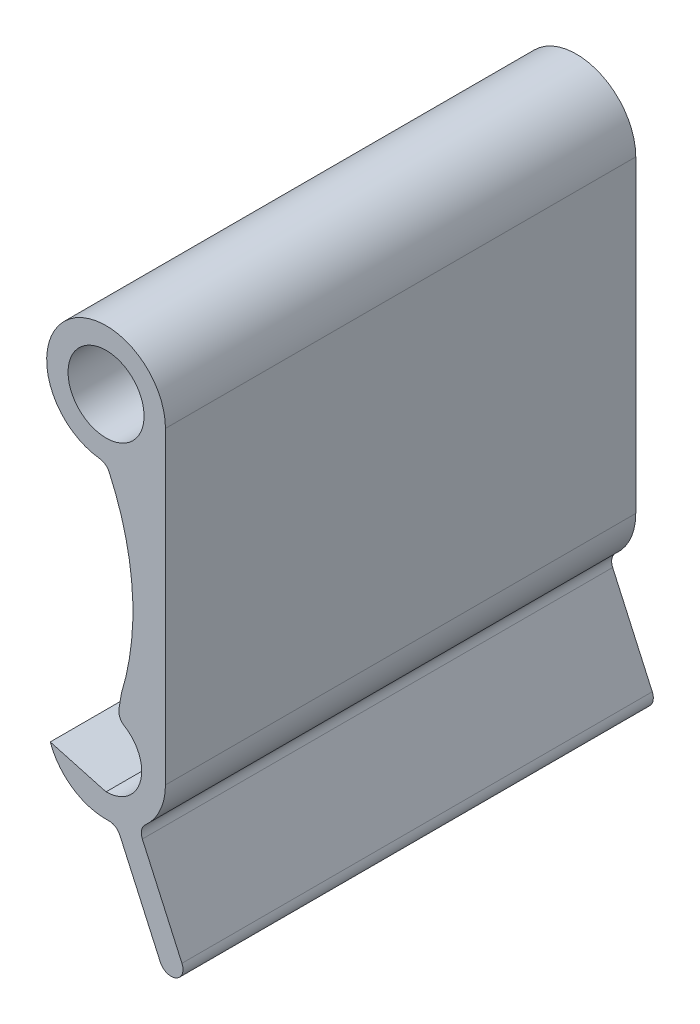
ISO-10303-21;
HEADER;
FILE_DESCRIPTION(('STEP AP214'),'2;1');
FILE_NAME('part.step','',(''),(''),'','','');
FILE_SCHEMA(('AUTOMOTIVE_DESIGN { 1 0 10303 214 1 1 1 1 }'));
ENDSEC;
DATA;
#1=APPLICATION_CONTEXT('core data for automotive mechanical design processes');
#2=APPLICATION_PROTOCOL_DEFINITION('international standard','automotive_design',2000,#1);
#3=PRODUCT_CONTEXT('',#1,'mechanical');
#4=PRODUCT('Part','Part','',(#3));
#5=PRODUCT_RELATED_PRODUCT_CATEGORY('part','',(#4));
#6=PRODUCT_DEFINITION_FORMATION('','',#4);
#7=PRODUCT_DEFINITION_CONTEXT('part definition',#1,'design');
#8=PRODUCT_DEFINITION('design','',#6,#7);
#9=PRODUCT_DEFINITION_SHAPE('','',#8);
#10=(LENGTH_UNIT() NAMED_UNIT(*) SI_UNIT(.MILLI.,.METRE.));
#11=(NAMED_UNIT(*) PLANE_ANGLE_UNIT() SI_UNIT($,.RADIAN.));
#12=(NAMED_UNIT(*) SI_UNIT($,.STERADIAN.) SOLID_ANGLE_UNIT());
#13=UNCERTAINTY_MEASURE_WITH_UNIT(LENGTH_MEASURE(1.E-05),#10,'distance_accuracy_value','');
#14=(GEOMETRIC_REPRESENTATION_CONTEXT(3) GLOBAL_UNCERTAINTY_ASSIGNED_CONTEXT((#13)) GLOBAL_UNIT_ASSIGNED_CONTEXT((#10,
#11,#12)) REPRESENTATION_CONTEXT('',''));
#15=CARTESIAN_POINT('',(0.,0.,0.));
#16=DIRECTION('',(0.,0.,1.));
#17=DIRECTION('',(1.,0.,0.));
#18=AXIS2_PLACEMENT_3D('',#15,#16,#17);
#19=CARTESIAN_POINT('',(0.,-13.,19.8));
#20=DIRECTION('',(0.,0.,-1.));
#21=DIRECTION('',(-1.,0.,0.));
#22=AXIS2_PLACEMENT_3D('',#19,#20,#21);
#23=CYLINDRICAL_SURFACE('',#22,2.5);
#24=CARTESIAN_POINT('',(0.,-13.,19.8));
#25=DIRECTION('',(0.,0.,1.));
#26=DIRECTION('',(1.,0.,0.));
#27=AXIS2_PLACEMENT_3D('',#24,#25,#26);
#28=CIRCLE('',#27,2.5);
#29=CARTESIAN_POINT('',(1.65310921890805,-14.8754279272639,19.8));
#30=VERTEX_POINT('',#29);
#31=CARTESIAN_POINT('',(2.5,-13.0000000000005,19.8));
#32=VERTEX_POINT('',#31);
#33=EDGE_CURVE('E206',#30,#32,#28,.T.);
#34=ORIENTED_EDGE('',*,*,#33,.F.);
#35=DIRECTION('',(0.,0.,-1.));
#36=VECTOR('',#35,1.);
#37=CARTESIAN_POINT('',(1.65310921890805,-14.8754279272639,19.8));
#38=LINE('',#37,#36);
#39=CARTESIAN_POINT('',(1.65310921890805,-14.8754279272639,0.));
#40=VERTEX_POINT('',#39);
#41=EDGE_CURVE('E308',#30,#40,#38,.T.);
#42=ORIENTED_EDGE('',*,*,#41,.T.);
#43=CARTESIAN_POINT('',(0.,-13.,0.));
#44=DIRECTION('',(0.,0.,1.));
#45=DIRECTION('',(1.,0.,0.));
#46=AXIS2_PLACEMENT_3D('',#43,#44,#45);
#47=CIRCLE('',#46,2.5);
#48=CARTESIAN_POINT('',(2.5,-13.0000000000005,0.));
#49=VERTEX_POINT('',#48);
#50=EDGE_CURVE('E237',#40,#49,#47,.T.);
#51=ORIENTED_EDGE('',*,*,#50,.T.);
#52=DIRECTION('',(0.,0.,-1.));
#53=VECTOR('',#52,1.);
#54=CARTESIAN_POINT('',(2.5,-13.0000000000005,19.8));
#55=LINE('',#54,#53);
#56=EDGE_CURVE('E247',#32,#49,#55,.T.);
#57=ORIENTED_EDGE('',*,*,#56,.F.);
#58=EDGE_LOOP('',(#34,#42,#51,#57));
#59=FACE_BOUND('',#58,.T.);
#60=ADVANCED_FACE('F47',(#59),#23,.T.);
#61=CARTESIAN_POINT('',(-2.34950306999728,-13.8543039997995,0.));
#62=VERTEX_POINT('',#61);
#63=CARTESIAN_POINT('',(0.105471364558041,-15.4977741673855,0.));
#64=VERTEX_POINT('',#63);
#65=EDGE_CURVE('E238',#62,#64,#47,.T.);
#66=ORIENTED_EDGE('',*,*,#65,.T.);
#67=DIRECTION('',(0.,0.,-1.));
#68=VECTOR('',#67,1.);
#69=CARTESIAN_POINT('',(0.10547136455804,-15.4977741673855,19.8));
#70=LINE('',#69,#68);
#71=CARTESIAN_POINT('',(0.105471364558041,-15.4977741673855,19.8));
#72=VERTEX_POINT('',#71);
#73=EDGE_CURVE('E304',#64,#72,#70,.F.);
#74=ORIENTED_EDGE('',*,*,#73,.T.);
#75=CARTESIAN_POINT('',(-2.34950306999728,-13.8543039997995,19.8));
#76=VERTEX_POINT('',#75);
#77=EDGE_CURVE('E207',#76,#72,#28,.T.);
#78=ORIENTED_EDGE('',*,*,#77,.F.);
#79=DIRECTION('',(0.,0.,-1.));
#80=VECTOR('',#79,1.);
#81=CARTESIAN_POINT('',(-2.34950306999728,-13.8543039997995,19.8));
#82=LINE('',#81,#80);
#83=EDGE_CURVE('E251',#76,#62,#82,.T.);
#84=ORIENTED_EDGE('',*,*,#83,.T.);
#85=EDGE_LOOP('',(#66,#74,#78,#84));
#86=FACE_BOUND('',#85,.T.);
#87=ADVANCED_FACE('F369',(#86),#23,.T.);
#88=CARTESIAN_POINT('',(0.,0.,19.8));
#89=DIRECTION('',(0.,0.,-1.));
#90=DIRECTION('',(-1.,0.,0.));
#91=AXIS2_PLACEMENT_3D('',#88,#89,#90);
#92=CYLINDRICAL_SURFACE('',#91,2.5);
#93=CARTESIAN_POINT('',(0.,0.,0.));
#94=DIRECTION('',(0.,0.,1.));
#95=DIRECTION('',(1.,0.,0.));
#96=AXIS2_PLACEMENT_3D('',#93,#94,#95);
#97=CIRCLE('',#96,2.5);
#98=CARTESIAN_POINT('',(2.5,2.44365617151077E-13,0.));
#99=VERTEX_POINT('',#98);
#100=CARTESIAN_POINT('',(-0.270271846246739,-2.48534768777457,0.));
#101=VERTEX_POINT('',#100);
#102=EDGE_CURVE('E220',#99,#101,#97,.T.);
#103=ORIENTED_EDGE('',*,*,#102,.T.);
#104=DIRECTION('',(0.,0.,-1.));
#105=VECTOR('',#104,1.);
#106=CARTESIAN_POINT('',(-0.270271846246739,-2.48534768777457,19.8));
#107=LINE('',#106,#105);
#108=CARTESIAN_POINT('',(-0.270271846246739,-2.48534768777457,19.8));
#109=VERTEX_POINT('',#108);
#110=EDGE_CURVE('E259',#101,#109,#107,.F.);
#111=ORIENTED_EDGE('',*,*,#110,.T.);
#112=CARTESIAN_POINT('',(0.,0.,19.8));
#113=DIRECTION('',(0.,0.,1.));
#114=DIRECTION('',(1.,0.,0.));
#115=AXIS2_PLACEMENT_3D('',#112,#113,#114);
#116=CIRCLE('',#115,2.5);
#117=CARTESIAN_POINT('',(2.5,2.44365617151077E-13,19.8));
#118=VERTEX_POINT('',#117);
#119=EDGE_CURVE('E193',#118,#109,#116,.T.);
#120=ORIENTED_EDGE('',*,*,#119,.F.);
#121=DIRECTION('',(0.,0.,-1.));
#122=VECTOR('',#121,1.);
#123=CARTESIAN_POINT('',(2.5,2.44365617151077E-13,19.8));
#124=LINE('',#123,#122);
#125=EDGE_CURVE('E215',#118,#99,#124,.T.);
#126=ORIENTED_EDGE('',*,*,#125,.T.);
#127=EDGE_LOOP('',(#103,#111,#120,#126));
#128=FACE_BOUND('',#127,.T.);
#129=ADVANCED_FACE('F374',(#128),#92,.T.);
#130=CARTESIAN_POINT('',(-9.86981448001657,-7.35662044327691,19.8));
#131=DIRECTION('',(0.,0.,-1.));
#132=DIRECTION('',(-1.,0.,0.));
#133=AXIS2_PLACEMENT_3D('',#130,#131,#132);
#134=CYLINDRICAL_SURFACE('',#133,11.);
#135=CARTESIAN_POINT('',(-9.86981448001657,-7.35662044327691,19.8));
#136=DIRECTION('',(0.,0.,1.));
#137=DIRECTION('',(1.,0.,0.));
#138=AXIS2_PLACEMENT_3D('',#135,#136,#137);
#139=CIRCLE('',#138,11.);
#140=CARTESIAN_POINT('',(0.645816542223172,-10.5848559062054,19.8));
#141=VERTEX_POINT('',#140);
#142=CARTESIAN_POINT('',(0.130220844719175,-2.77412183399865,19.8));
#143=VERTEX_POINT('',#142);
#144=EDGE_CURVE('E175',#141,#143,#139,.T.);
#145=ORIENTED_EDGE('',*,*,#144,.T.);
#146=DIRECTION('',(0.,0.,-1.));
#147=VECTOR('',#146,1.);
#148=CARTESIAN_POINT('',(0.130220844719177,-2.77412183399865,19.8));
#149=LINE('',#148,#147);
#150=CARTESIAN_POINT('',(0.130220844719175,-2.77412183399865,0.));
#151=VERTEX_POINT('',#150);
#152=EDGE_CURVE('E185',#143,#151,#149,.T.);
#153=ORIENTED_EDGE('',*,*,#152,.T.);
#154=CARTESIAN_POINT('',(-9.86981448001657,-7.35662044327691,0.));
#155=DIRECTION('',(0.,0.,1.));
#156=DIRECTION('',(1.,0.,0.));
#157=AXIS2_PLACEMENT_3D('',#154,#155,#156);
#158=CIRCLE('',#157,11.);
#159=CARTESIAN_POINT('',(0.645816542223172,-10.5848559062054,0.));
#160=VERTEX_POINT('',#159);
#161=EDGE_CURVE('E183',#160,#151,#158,.T.);
#162=ORIENTED_EDGE('',*,*,#161,.F.);
#163=DIRECTION('',(0.,0.,-1.));
#164=VECTOR('',#163,1.);
#165=CARTESIAN_POINT('',(0.645816542223172,-10.5848559062054,19.8));
#166=LINE('',#165,#164);
#167=EDGE_CURVE('E166',#141,#160,#166,.T.);
#168=ORIENTED_EDGE('',*,*,#167,.F.);
#169=EDGE_LOOP('',(#145,#153,#162,#168));
#170=FACE_BOUND('',#169,.T.);
#171=ADVANCED_FACE('F179',(#170),#134,.F.);
#172=CARTESIAN_POINT('',(2.32846829789905,-0.384088888888882,19.8));
#173=DIRECTION('',(-0.986666666666667,0.162754074876448,0.));
#174=DIRECTION('',(-0.162754074876448,-0.986666666666667,0.));
#175=AXIS2_PLACEMENT_3D('',#172,#173,#174);
#176=PLANE('',#175);
#177=DIRECTION('',(0.162754074876448,0.986666666666667,0.));
#178=VECTOR('',#177,1.);
#179=CARTESIAN_POINT('',(2.32846829789905,-0.384088888888882,0.));
#180=LINE('',#179,#178);
#181=CARTESIAN_POINT('',(0.543014796365575,-11.2080725967235,0.));
#182=VERTEX_POINT('',#181);
#183=EDGE_CURVE('E227',#182,#160,#180,.T.);
#184=ORIENTED_EDGE('',*,*,#183,.F.);
#185=DIRECTION('',(0.,0.,-1.));
#186=VECTOR('',#185,1.);
#187=CARTESIAN_POINT('',(0.543014796365576,-11.2080725967235,19.8));
#188=LINE('',#187,#186);
#189=CARTESIAN_POINT('',(0.543014796365575,-11.2080725967235,19.8));
#190=VERTEX_POINT('',#189);
#191=EDGE_CURVE('E169',#182,#190,#188,.F.);
#192=ORIENTED_EDGE('',*,*,#191,.T.);
#193=DIRECTION('',(0.162754074876448,0.986666666666667,0.));
#194=VECTOR('',#193,1.);
#195=CARTESIAN_POINT('',(2.32846829789905,-0.384088888888882,19.8));
#196=LINE('',#195,#194);
#197=EDGE_CURVE('E162',#190,#141,#196,.T.);
#198=ORIENTED_EDGE('',*,*,#197,.T.);
#199=ORIENTED_EDGE('',*,*,#167,.T.);
#200=EDGE_LOOP('',(#184,#192,#198,#199));
#201=FACE_BOUND('',#200,.T.);
#202=ADVANCED_FACE('F165',(#201),#176,.T.);
#203=CARTESIAN_POINT('',(0.,-13.,19.8));
#204=DIRECTION('',(0.,0.,-1.));
#205=DIRECTION('',(-1.,0.,0.));
#206=AXIS2_PLACEMENT_3D('',#203,#204,#205);
#207=CYLINDRICAL_SURFACE('',#206,1.5);
#208=CARTESIAN_POINT('',(0.,-13.,19.8));
#209=DIRECTION('',(0.,0.,1.));
#210=DIRECTION('',(1.,0.,0.));
#211=AXIS2_PLACEMENT_3D('',#208,#209,#210);
#212=CIRCLE('',#211,1.5);
#213=CARTESIAN_POINT('',(0.,-14.5,19.8));
#214=VERTEX_POINT('',#213);
#215=CARTESIAN_POINT('',(0.777261097274181,-11.7170872256213,19.8));
#216=VERTEX_POINT('',#215);
#217=EDGE_CURVE('E174',#214,#216,#212,.T.);
#218=ORIENTED_EDGE('',*,*,#217,.T.);
#219=DIRECTION('',(0.,0.,-1.));
#220=VECTOR('',#219,1.);
#221=CARTESIAN_POINT('',(0.777261097274181,-11.7170872256213,19.8));
#222=LINE('',#221,#220);
#223=CARTESIAN_POINT('',(0.777261097274181,-11.7170872256213,0.));
#224=VERTEX_POINT('',#223);
#225=EDGE_CURVE('E262',#216,#224,#222,.T.);
#226=ORIENTED_EDGE('',*,*,#225,.T.);
#227=CARTESIAN_POINT('',(0.,-13.,0.));
#228=DIRECTION('',(0.,0.,1.));
#229=DIRECTION('',(1.,0.,0.));
#230=AXIS2_PLACEMENT_3D('',#227,#228,#229);
#231=CIRCLE('',#230,1.5);
#232=CARTESIAN_POINT('',(0.,-14.5,0.));
#233=VERTEX_POINT('',#232);
#234=EDGE_CURVE('E230',#233,#224,#231,.T.);
#235=ORIENTED_EDGE('',*,*,#234,.F.);
#236=DIRECTION('',(0.,0.,-1.));
#237=VECTOR('',#236,1.);
#238=CARTESIAN_POINT('',(0.,-14.5,19.8));
#239=LINE('',#238,#237);
#240=EDGE_CURVE('E186',#214,#233,#239,.T.);
#241=ORIENTED_EDGE('',*,*,#240,.F.);
#242=EDGE_LOOP('',(#218,#226,#235,#241));
#243=FACE_BOUND('',#242,.T.);
#244=ADVANCED_FACE('F380',(#243),#207,.F.);
#245=CARTESIAN_POINT('',(-3.70508886709022,-13.4817586993532,19.8));
#246=DIRECTION('',(-0.264997241449119,-0.964249170092646,0.));
#247=DIRECTION('',(0.964249170092646,-0.264997241449119,0.));
#248=AXIS2_PLACEMENT_3D('',#245,#246,#247);
#249=PLANE('',#248);
#250=DIRECTION('',(-0.964249170092646,0.264997241449119,0.));
#251=VECTOR('',#250,1.);
#252=CARTESIAN_POINT('',(-3.70508886709022,-13.4817586993532,0.));
#253=LINE('',#252,#251);
#254=EDGE_CURVE('E234',#233,#62,#253,.T.);
#255=ORIENTED_EDGE('',*,*,#254,.T.);
#256=ORIENTED_EDGE('',*,*,#83,.F.);
#257=DIRECTION('',(-0.964249170092646,0.264997241449119,0.));
#258=VECTOR('',#257,1.);
#259=CARTESIAN_POINT('',(-3.70508886709022,-13.4817586993532,19.8));
#260=LINE('',#259,#258);
#261=EDGE_CURVE('E203',#214,#76,#260,.T.);
#262=ORIENTED_EDGE('',*,*,#261,.F.);
#263=ORIENTED_EDGE('',*,*,#240,.T.);
#264=EDGE_LOOP('',(#255,#256,#262,#263));
#265=FACE_BOUND('',#264,.T.);
#266=ADVANCED_FACE('F377',(#265),#249,.F.);
#267=CARTESIAN_POINT('',(0.,0.,19.8));
#268=DIRECTION('',(0.,0.,-1.));
#269=DIRECTION('',(-1.,0.,0.));
#270=AXIS2_PLACEMENT_3D('',#267,#268,#269);
#271=CYLINDRICAL_SURFACE('',#270,1.6);
#272=CARTESIAN_POINT('',(0.,0.,19.8));
#273=DIRECTION('',(0.,0.,1.));
#274=DIRECTION('',(1.,0.,0.));
#275=AXIS2_PLACEMENT_3D('',#272,#273,#274);
#276=CIRCLE('',#275,1.6);
#277=CARTESIAN_POINT('',(-1.6,0.,19.8));
#278=VERTEX_POINT('',#277);
#279=EDGE_CURVE('E196',#278,#278,#276,.T.);
#280=CARTESIAN_POINT('',(0.,0.,0.));
#281=DIRECTION('',(0.,0.,1.));
#282=DIRECTION('',(1.,0.,0.));
#283=AXIS2_PLACEMENT_3D('',#280,#281,#282);
#284=CIRCLE('',#283,1.6);
#285=CARTESIAN_POINT('',(-1.6,0.,0.));
#286=VERTEX_POINT('',#285);
#287=EDGE_CURVE('E216',#286,#286,#284,.T.);
#288=CARTESIAN_POINT('',(-1.6,0.,19.8));
#289=CARTESIAN_POINT('',(-1.6,0.,19.59375));
#290=CARTESIAN_POINT('',(-1.6,0.,19.3875));
#291=CARTESIAN_POINT('',(-1.6,0.,18.975));
#292=CARTESIAN_POINT('',(-1.6,0.,18.76875));
#293=CARTESIAN_POINT('',(-1.6,0.,18.35625));
#294=CARTESIAN_POINT('',(-1.6,0.,18.15));
#295=CARTESIAN_POINT('',(-1.6,0.,17.7375));
#296=CARTESIAN_POINT('',(-1.6,0.,17.53125));
#297=CARTESIAN_POINT('',(-1.6,0.,17.11875));
#298=CARTESIAN_POINT('',(-1.6,0.,16.9125));
#299=CARTESIAN_POINT('',(-1.6,0.,16.5));
#300=CARTESIAN_POINT('',(-1.6,0.,16.29375));
#301=CARTESIAN_POINT('',(-1.6,0.,15.88125));
#302=CARTESIAN_POINT('',(-1.6,0.,15.675));
#303=CARTESIAN_POINT('',(-1.6,0.,15.2625));
#304=CARTESIAN_POINT('',(-1.6,0.,15.05625));
#305=CARTESIAN_POINT('',(-1.6,0.,14.64375));
#306=CARTESIAN_POINT('',(-1.6,0.,14.4375));
#307=CARTESIAN_POINT('',(-1.6,0.,14.025));
#308=CARTESIAN_POINT('',(-1.6,0.,13.81875));
#309=CARTESIAN_POINT('',(-1.6,0.,13.40625));
#310=CARTESIAN_POINT('',(-1.6,0.,13.2));
#311=CARTESIAN_POINT('',(-1.6,0.,12.7875));
#312=CARTESIAN_POINT('',(-1.6,0.,12.58125));
#313=CARTESIAN_POINT('',(-1.6,0.,12.16875));
#314=CARTESIAN_POINT('',(-1.6,0.,11.9625));
#315=CARTESIAN_POINT('',(-1.6,0.,11.55));
#316=CARTESIAN_POINT('',(-1.6,0.,11.34375));
#317=CARTESIAN_POINT('',(-1.6,0.,10.93125));
#318=CARTESIAN_POINT('',(-1.6,0.,10.725));
#319=CARTESIAN_POINT('',(-1.6,0.,10.3125));
#320=CARTESIAN_POINT('',(-1.6,0.,10.10625));
#321=CARTESIAN_POINT('',(-1.6,0.,9.69375));
#322=CARTESIAN_POINT('',(-1.6,0.,9.4875));
#323=CARTESIAN_POINT('',(-1.6,0.,9.075));
#324=CARTESIAN_POINT('',(-1.6,0.,8.86875));
#325=CARTESIAN_POINT('',(-1.6,0.,8.45625));
#326=CARTESIAN_POINT('',(-1.6,0.,8.25));
#327=CARTESIAN_POINT('',(-1.6,0.,7.8375));
#328=CARTESIAN_POINT('',(-1.6,0.,7.63125));
#329=CARTESIAN_POINT('',(-1.6,0.,7.21875));
#330=CARTESIAN_POINT('',(-1.6,0.,7.0125));
#331=CARTESIAN_POINT('',(-1.6,0.,6.6));
#332=CARTESIAN_POINT('',(-1.6,0.,6.39375));
#333=CARTESIAN_POINT('',(-1.6,0.,5.98125));
#334=CARTESIAN_POINT('',(-1.6,0.,5.775));
#335=CARTESIAN_POINT('',(-1.6,0.,5.3625));
#336=CARTESIAN_POINT('',(-1.6,0.,5.15625));
#337=CARTESIAN_POINT('',(-1.6,0.,4.74375));
#338=CARTESIAN_POINT('',(-1.6,0.,4.5375));
#339=CARTESIAN_POINT('',(-1.6,0.,4.125));
#340=CARTESIAN_POINT('',(-1.6,0.,3.91875));
#341=CARTESIAN_POINT('',(-1.6,0.,3.50625));
#342=CARTESIAN_POINT('',(-1.6,0.,3.3));
#343=CARTESIAN_POINT('',(-1.6,0.,2.8875));
#344=CARTESIAN_POINT('',(-1.6,0.,2.68125));
#345=CARTESIAN_POINT('',(-1.6,0.,2.26875));
#346=CARTESIAN_POINT('',(-1.6,0.,2.0625));
#347=CARTESIAN_POINT('',(-1.6,0.,1.65));
#348=CARTESIAN_POINT('',(-1.6,0.,1.44375));
#349=CARTESIAN_POINT('',(-1.6,0.,1.03125));
#350=CARTESIAN_POINT('',(-1.6,0.,0.825));
#351=CARTESIAN_POINT('',(-1.6,0.,0.412500000000001));
#352=CARTESIAN_POINT('',(-1.6,0.,0.206250000000001));
#353=CARTESIAN_POINT('',(-1.6,0.,0.));
#354=B_SPLINE_CURVE_WITH_KNOTS('',3,(#288,#289,#290,#291,#292,#293,#294,#295,#296,#297,#298,
#299,#300,#301,#302,#303,#304,#305,#306,#307,#308,#309,#310,#311,#312,#313,#314,#315,#316,#317,
#318,#319,#320,#321,#322,#323,#324,#325,#326,#327,#328,#329,#330,#331,#332,#333,#334,#335,#336,
#337,#338,#339,#340,#341,#342,#343,#344,#345,#346,#347,#348,#349,#350,#351,#352,#353),
.UNSPECIFIED.,.F.,.F.,(4,2,2,2,2,2,2,2,2,2,2,2,2,2,2,2,2,2,2,2,2,2,2,2,2,2,2,2,2,2,2,2,4),(0.,
0.618749999999998,1.2375,1.85625,2.475,3.09375,3.7125,4.33125,4.95,5.56875,6.1875,6.80625,7.425,
8.04375,8.6625,9.28125,9.9,10.51875,11.1375,11.75625,12.375,12.99375,13.6125,14.23125,14.85,
15.46875,16.0875,16.70625,17.325,17.94375,18.5625,19.18125,19.8),.UNSPECIFIED.);
#355=EDGE_CURVE('BSEAM351',#278,#286,#354,.T.);
#356=ORIENTED_EDGE('',*,*,#279,.T.);
#357=ORIENTED_EDGE('',*,*,#287,.F.);
#358=ORIENTED_EDGE('',*,*,#355,.T.);
#359=ORIENTED_EDGE('',*,*,#355,.F.);
#360=EDGE_LOOP('',(#356,#358,#357,#359));
#361=FACE_BOUND('',#360,.T.);
#362=ADVANCED_FACE('F351',(#361),#271,.F.);
#363=CARTESIAN_POINT('',(2.5,0.,19.8));
#364=DIRECTION('',(1.,0.,0.));
#365=DIRECTION('',(0.,1.,0.));
#366=AXIS2_PLACEMENT_3D('',#363,#364,#365);
#367=PLANE('',#366);
#368=DIRECTION('',(0.,-1.,0.));
#369=VECTOR('',#368,1.);
#370=CARTESIAN_POINT('',(2.5,0.,0.));
#371=LINE('',#370,#369);
#372=EDGE_CURVE('E241',#99,#49,#371,.T.);
#373=ORIENTED_EDGE('',*,*,#372,.F.);
#374=ORIENTED_EDGE('',*,*,#125,.F.);
#375=DIRECTION('',(0.,-1.,0.));
#376=VECTOR('',#375,1.);
#377=CARTESIAN_POINT('',(2.5,0.,19.8));
#378=LINE('',#377,#376);
#379=EDGE_CURVE('E211',#118,#32,#378,.T.);
#380=ORIENTED_EDGE('',*,*,#379,.T.);
#381=ORIENTED_EDGE('',*,*,#56,.T.);
#382=EDGE_LOOP('',(#373,#374,#380,#381));
#383=FACE_BOUND('',#382,.T.);
#384=ADVANCED_FACE('F355',(#383),#367,.T.);
#385=CARTESIAN_POINT('',(0.,0.,19.8));
#386=DIRECTION('',(0.,0.,1.));
#387=DIRECTION('',(1.,0.,0.));
#388=AXIS2_PLACEMENT_3D('',#385,#386,#387);
#389=PLANE('',#388);
#390=ORIENTED_EDGE('',*,*,#279,.F.);
#391=EDGE_LOOP('',(#390));
#392=FACE_BOUND('',#391,.T.);
#393=CARTESIAN_POINT('',(2.73899063210616,-19.3589807230494,19.8));
#394=DIRECTION('',(0.,0.,1.));
#395=DIRECTION('',(1.,0.,0.));
#396=AXIS2_PLACEMENT_3D('',#393,#394,#395);
#397=CIRCLE('',#396,0.5);
#398=CARTESIAN_POINT('',(2.28316998576444,-19.5644741253002,19.8));
#399=VERTEX_POINT('',#398);
#400=CARTESIAN_POINT('',(2.94448403435697,-19.8148013693911,19.8));
#401=VERTEX_POINT('',#400);
#402=EDGE_CURVE('E279',#399,#401,#397,.T.);
#403=ORIENTED_EDGE('',*,*,#402,.T.);
#404=CARTESIAN_POINT('',(2.73899063210616,-19.3589807230494,19.8));
#405=DIRECTION('',(0.,0.,1.));
#406=DIRECTION('',(1.,0.,0.));
#407=AXIS2_PLACEMENT_3D('',#404,#405,#406);
#408=CIRCLE('',#407,0.5);
#409=CARTESIAN_POINT('',(3.19481127844788,-19.1534873207986,19.8));
#410=VERTEX_POINT('',#409);
#411=EDGE_CURVE('E282',#401,#410,#408,.T.);
#412=ORIENTED_EDGE('',*,*,#411,.T.);
#413=DIRECTION('',(0.410986804501632,-0.911641292683442,0.));
#414=VECTOR('',#413,1.);
#415=CARTESIAN_POINT('',(-4.52111056242627,-2.03821042087807,19.8));
#416=LINE('',#415,#414);
#417=CARTESIAN_POINT('',(1.52791041634795,-15.4560069149674,19.8));
#418=VERTEX_POINT('',#417);
#419=EDGE_CURVE('E322',#418,#410,#416,.T.);
#420=ORIENTED_EDGE('',*,*,#419,.F.);
#421=CARTESIAN_POINT('',(1.98373106268966,-15.2505135127166,19.8));
#422=DIRECTION('',(0.,0.,1.));
#423=DIRECTION('',(1.,0.,0.));
#424=AXIS2_PLACEMENT_3D('',#421,#422,#423);
#425=CIRCLE('',#424,0.5);
#426=EDGE_CURVE('E57',#418,#30,#425,.F.);
#427=ORIENTED_EDGE('',*,*,#426,.T.);
#428=ORIENTED_EDGE('',*,*,#33,.T.);
#429=ORIENTED_EDGE('',*,*,#379,.F.);
#430=ORIENTED_EDGE('',*,*,#119,.T.);
#431=CARTESIAN_POINT('',(-0.324326215496086,-2.98241722532948,19.8));
#432=DIRECTION('',(0.,0.,1.));
#433=DIRECTION('',(1.,0.,0.));
#434=AXIS2_PLACEMENT_3D('',#431,#432,#433);
#435=CIRCLE('',#434,0.5);
#436=EDGE_CURVE('E191',#109,#143,#435,.F.);
#437=ORIENTED_EDGE('',*,*,#436,.T.);
#438=ORIENTED_EDGE('',*,*,#144,.F.);
#439=ORIENTED_EDGE('',*,*,#197,.F.);
#440=CARTESIAN_POINT('',(1.03634812969891,-11.2894496341617,19.8));
#441=DIRECTION('',(0.,0.,1.));
#442=DIRECTION('',(1.,0.,0.));
#443=AXIS2_PLACEMENT_3D('',#440,#441,#442);
#444=CIRCLE('',#443,0.5);
#445=EDGE_CURVE('E271',#190,#216,#444,.T.);
#446=ORIENTED_EDGE('',*,*,#445,.T.);
#447=ORIENTED_EDGE('',*,*,#217,.F.);
#448=ORIENTED_EDGE('',*,*,#261,.T.);
#449=ORIENTED_EDGE('',*,*,#77,.T.);
#450=CARTESIAN_POINT('',(0.126565637469648,-15.9973290008626,19.8));
#451=DIRECTION('',(0.,0.,1.));
#452=DIRECTION('',(1.,0.,0.));
#453=AXIS2_PLACEMENT_3D('',#450,#451,#452);
#454=CIRCLE('',#453,0.5);
#455=CARTESIAN_POINT('',(0.582386283811368,-15.7918355986118,19.8));
#456=VERTEX_POINT('',#455);
#457=EDGE_CURVE('E311',#72,#456,#454,.F.);
#458=ORIENTED_EDGE('',*,*,#457,.T.);
#459=DIRECTION('',(-0.410986804501632,0.911641292683442,0.));
#460=VECTOR('',#459,1.);
#461=CARTESIAN_POINT('',(-5.43275185510972,-2.44919722537971,19.8));
#462=LINE('',#461,#460);
#463=EDGE_CURVE('E342',#399,#456,#462,.T.);
#464=ORIENTED_EDGE('',*,*,#463,.F.);
#465=EDGE_LOOP('',(#403,#412,#420,#427,#428,#429,#430,#437,#438,#439,#446,#447,#448,#449,#458,#464));
#466=FACE_BOUND('',#465,.T.);
#467=ADVANCED_FACE('F188',(#392,#466),#389,.T.);
#468=CARTESIAN_POINT('',(0.,0.,0.));
#469=DIRECTION('',(0.,0.,1.));
#470=DIRECTION('',(1.,0.,0.));
#471=AXIS2_PLACEMENT_3D('',#468,#469,#470);
#472=PLANE('',#471);
#473=ORIENTED_EDGE('',*,*,#287,.T.);
#474=EDGE_LOOP('',(#473));
#475=FACE_BOUND('',#474,.T.);
#476=DIRECTION('',(-0.410986804501632,0.911641292683442,0.));
#477=VECTOR('',#476,1.);
#478=CARTESIAN_POINT('',(-4.52111056242627,-2.03821042087807,0.));
#479=LINE('',#478,#477);
#480=CARTESIAN_POINT('',(3.19481127844788,-19.1534873207986,0.));
#481=VERTEX_POINT('',#480);
#482=CARTESIAN_POINT('',(1.52791041634795,-15.4560069149674,0.));
#483=VERTEX_POINT('',#482);
#484=EDGE_CURVE('E333',#481,#483,#479,.T.);
#485=ORIENTED_EDGE('',*,*,#484,.F.);
#486=CARTESIAN_POINT('',(2.73899063210616,-19.3589807230494,0.));
#487=DIRECTION('',(0.,0.,1.));
#488=DIRECTION('',(1.,0.,0.));
#489=AXIS2_PLACEMENT_3D('',#486,#487,#488);
#490=CIRCLE('',#489,0.5);
#491=CARTESIAN_POINT('',(2.94448403435697,-19.8148013693911,0.));
#492=VERTEX_POINT('',#491);
#493=EDGE_CURVE('E295',#481,#492,#490,.F.);
#494=ORIENTED_EDGE('',*,*,#493,.T.);
#495=CARTESIAN_POINT('',(2.73899063210616,-19.3589807230494,0.));
#496=DIRECTION('',(0.,0.,1.));
#497=DIRECTION('',(1.,0.,0.));
#498=AXIS2_PLACEMENT_3D('',#495,#496,#497);
#499=CIRCLE('',#498,0.5);
#500=CARTESIAN_POINT('',(2.28316998576444,-19.5644741253002,0.));
#501=VERTEX_POINT('',#500);
#502=EDGE_CURVE('E70',#492,#501,#499,.F.);
#503=ORIENTED_EDGE('',*,*,#502,.T.);
#504=DIRECTION('',(0.410986804501632,-0.911641292683442,0.));
#505=VECTOR('',#504,1.);
#506=CARTESIAN_POINT('',(-5.43275185510972,-2.44919722537971,0.));
#507=LINE('',#506,#505);
#508=CARTESIAN_POINT('',(0.582386283811369,-15.7918355986118,0.));
#509=VERTEX_POINT('',#508);
#510=EDGE_CURVE('E221',#509,#501,#507,.T.);
#511=ORIENTED_EDGE('',*,*,#510,.F.);
#512=CARTESIAN_POINT('',(0.126565637469648,-15.9973290008626,0.));
#513=DIRECTION('',(0.,0.,1.));
#514=DIRECTION('',(1.,0.,0.));
#515=AXIS2_PLACEMENT_3D('',#512,#513,#514);
#516=CIRCLE('',#515,0.5);
#517=EDGE_CURVE('E64',#509,#64,#516,.T.);
#518=ORIENTED_EDGE('',*,*,#517,.T.);
#519=ORIENTED_EDGE('',*,*,#65,.F.);
#520=ORIENTED_EDGE('',*,*,#254,.F.);
#521=ORIENTED_EDGE('',*,*,#234,.T.);
#522=CARTESIAN_POINT('',(1.03634812969891,-11.2894496341617,0.));
#523=DIRECTION('',(0.,0.,1.));
#524=DIRECTION('',(1.,0.,0.));
#525=AXIS2_PLACEMENT_3D('',#522,#523,#524);
#526=CIRCLE('',#525,0.5);
#527=EDGE_CURVE('E266',#224,#182,#526,.F.);
#528=ORIENTED_EDGE('',*,*,#527,.T.);
#529=ORIENTED_EDGE('',*,*,#183,.T.);
#530=ORIENTED_EDGE('',*,*,#161,.T.);
#531=CARTESIAN_POINT('',(-0.324326215496086,-2.98241722532948,0.));
#532=DIRECTION('',(0.,0.,1.));
#533=DIRECTION('',(1.,0.,0.));
#534=AXIS2_PLACEMENT_3D('',#531,#532,#533);
#535=CIRCLE('',#534,0.5);
#536=EDGE_CURVE('E274',#151,#101,#535,.T.);
#537=ORIENTED_EDGE('',*,*,#536,.T.);
#538=ORIENTED_EDGE('',*,*,#102,.F.);
#539=ORIENTED_EDGE('',*,*,#372,.T.);
#540=ORIENTED_EDGE('',*,*,#50,.F.);
#541=CARTESIAN_POINT('',(1.98373106268966,-15.2505135127166,0.));
#542=DIRECTION('',(0.,0.,1.));
#543=DIRECTION('',(1.,0.,0.));
#544=AXIS2_PLACEMENT_3D('',#541,#542,#543);
#545=CIRCLE('',#544,0.5);
#546=EDGE_CURVE('E11',#40,#483,#545,.T.);
#547=ORIENTED_EDGE('',*,*,#546,.T.);
#548=EDGE_LOOP('',(#485,#494,#503,#511,#518,#519,#520,#521,#528,#529,#530,#537,#538,#539,#540,#547));
#549=FACE_BOUND('',#548,.T.);
#550=ADVANCED_FACE('F332',(#475,#549),#472,.F.);
#551=CARTESIAN_POINT('',(-0.324326215496086,-2.98241722532948,19.8));
#552=DIRECTION('',(0.,0.,-1.));
#553=DIRECTION('',(-1.,0.,0.));
#554=AXIS2_PLACEMENT_3D('',#551,#552,#553);
#555=CYLINDRICAL_SURFACE('',#554,0.5);
#556=ORIENTED_EDGE('',*,*,#436,.F.);
#557=ORIENTED_EDGE('',*,*,#110,.F.);
#558=ORIENTED_EDGE('',*,*,#536,.F.);
#559=ORIENTED_EDGE('',*,*,#152,.F.);
#560=EDGE_LOOP('',(#556,#557,#558,#559));
#561=FACE_BOUND('',#560,.T.);
#562=ADVANCED_FACE('F361',(#561),#555,.F.);
#563=CARTESIAN_POINT('',(1.03634812969891,-11.2894496341617,19.8));
#564=DIRECTION('',(0.,0.,-1.));
#565=DIRECTION('',(-1.,0.,0.));
#566=AXIS2_PLACEMENT_3D('',#563,#564,#565);
#567=CYLINDRICAL_SURFACE('',#566,0.5);
#568=ORIENTED_EDGE('',*,*,#445,.F.);
#569=ORIENTED_EDGE('',*,*,#191,.F.);
#570=ORIENTED_EDGE('',*,*,#527,.F.);
#571=ORIENTED_EDGE('',*,*,#225,.F.);
#572=EDGE_LOOP('',(#568,#569,#570,#571));
#573=FACE_BOUND('',#572,.T.);
#574=ADVANCED_FACE('F396',(#573),#567,.T.);
#575=CARTESIAN_POINT('',(-4.52111056242627,-2.03821042087807,-5.75012920434941));
#576=DIRECTION('',(-0.911641292683442,-0.410986804501632,0.));
#577=DIRECTION('',(0.410986804501632,-0.911641292683442,0.));
#578=AXIS2_PLACEMENT_3D('',#575,#576,#577);
#579=PLANE('',#578);
#580=ORIENTED_EDGE('',*,*,#419,.T.);
#581=DIRECTION('',(0.,0.,1.));
#582=VECTOR('',#581,1.);
#583=CARTESIAN_POINT('',(3.19481127844788,-19.1534873207986,-5.75012920434941));
#584=LINE('',#583,#582);
#585=EDGE_CURVE('E289',#410,#481,#584,.F.);
#586=ORIENTED_EDGE('',*,*,#585,.T.);
#587=ORIENTED_EDGE('',*,*,#484,.T.);
#588=DIRECTION('',(0.,0.,1.));
#589=VECTOR('',#588,1.);
#590=CARTESIAN_POINT('',(1.52791041634794,-15.4560069149674,19.8));
#591=LINE('',#590,#589);
#592=EDGE_CURVE('E285',#483,#418,#591,.T.);
#593=ORIENTED_EDGE('',*,*,#592,.T.);
#594=EDGE_LOOP('',(#580,#586,#587,#593));
#595=FACE_BOUND('',#594,.T.);
#596=ADVANCED_FACE('F335',(#595),#579,.F.);
#597=CARTESIAN_POINT('',(-5.43275185510972,-2.44919722537971,-5.75012920434941));
#598=DIRECTION('',(0.911641292683442,0.410986804501632,0.));
#599=DIRECTION('',(-0.410986804501632,0.911641292683442,0.));
#600=AXIS2_PLACEMENT_3D('',#597,#598,#599);
#601=PLANE('',#600);
#602=ORIENTED_EDGE('',*,*,#510,.T.);
#603=DIRECTION('',(0.,0.,1.));
#604=VECTOR('',#603,1.);
#605=CARTESIAN_POINT('',(2.28316998576444,-19.5644741253002,-5.75012920434941));
#606=LINE('',#605,#604);
#607=EDGE_CURVE('E301',#501,#399,#606,.T.);
#608=ORIENTED_EDGE('',*,*,#607,.T.);
#609=ORIENTED_EDGE('',*,*,#463,.T.);
#610=DIRECTION('',(0.,0.,1.));
#611=VECTOR('',#610,1.);
#612=CARTESIAN_POINT('',(0.582386283811368,-15.7918355986118,0.));
#613=LINE('',#612,#611);
#614=EDGE_CURVE('E298',#456,#509,#613,.F.);
#615=ORIENTED_EDGE('',*,*,#614,.T.);
#616=EDGE_LOOP('',(#602,#608,#609,#615));
#617=FACE_BOUND('',#616,.T.);
#618=ADVANCED_FACE('F407',(#617),#601,.F.);
#619=CARTESIAN_POINT('',(2.73899063210616,-19.3589807230494,-5.75012920434941));
#620=DIRECTION('',(0.,0.,1.));
#621=DIRECTION('',(1.,0.,0.));
#622=AXIS2_PLACEMENT_3D('',#619,#620,#621);
#623=CYLINDRICAL_SURFACE('',#622,0.5);
#624=ORIENTED_EDGE('',*,*,#607,.F.);
#625=ORIENTED_EDGE('',*,*,#502,.F.);
#626=DIRECTION('',(0.,0.,1.));
#627=VECTOR('',#626,1.);
#628=CARTESIAN_POINT('',(2.94448403435697,-19.8148013693911,-5.75012920434941));
#629=LINE('',#628,#627);
#630=EDGE_CURVE('E51',#401,#492,#629,.F.);
#631=ORIENTED_EDGE('',*,*,#630,.F.);
#632=ORIENTED_EDGE('',*,*,#402,.F.);
#633=EDGE_LOOP('',(#624,#625,#631,#632));
#634=FACE_BOUND('',#633,.T.);
#635=ADVANCED_FACE('F404',(#634),#623,.T.);
#636=CARTESIAN_POINT('',(2.73899063210616,-19.3589807230494,-5.75012920434941));
#637=DIRECTION('',(0.,0.,1.));
#638=DIRECTION('',(1.,0.,0.));
#639=AXIS2_PLACEMENT_3D('',#636,#637,#638);
#640=CYLINDRICAL_SURFACE('',#639,0.5);
#641=ORIENTED_EDGE('',*,*,#493,.F.);
#642=ORIENTED_EDGE('',*,*,#585,.F.);
#643=ORIENTED_EDGE('',*,*,#411,.F.);
#644=ORIENTED_EDGE('',*,*,#630,.T.);
#645=EDGE_LOOP('',(#641,#642,#643,#644));
#646=FACE_BOUND('',#645,.T.);
#647=ADVANCED_FACE('F400',(#646),#640,.T.);
#648=CARTESIAN_POINT('',(0.126565637469648,-15.9973290008626,19.8));
#649=DIRECTION('',(0.,0.,-1.));
#650=DIRECTION('',(-1.,0.,0.));
#651=AXIS2_PLACEMENT_3D('',#648,#649,#650);
#652=CYLINDRICAL_SURFACE('',#651,0.5);
#653=ORIENTED_EDGE('',*,*,#517,.F.);
#654=ORIENTED_EDGE('',*,*,#614,.F.);
#655=ORIENTED_EDGE('',*,*,#457,.F.);
#656=ORIENTED_EDGE('',*,*,#73,.F.);
#657=EDGE_LOOP('',(#653,#654,#655,#656));
#658=FACE_BOUND('',#657,.T.);
#659=ADVANCED_FACE('F403',(#658),#652,.F.);
#660=CARTESIAN_POINT('',(1.98373106268966,-15.2505135127166,19.8));
#661=DIRECTION('',(0.,0.,-1.));
#662=DIRECTION('',(-1.,0.,0.));
#663=AXIS2_PLACEMENT_3D('',#660,#661,#662);
#664=CYLINDRICAL_SURFACE('',#663,0.5);
#665=ORIENTED_EDGE('',*,*,#546,.F.);
#666=ORIENTED_EDGE('',*,*,#41,.F.);
#667=ORIENTED_EDGE('',*,*,#426,.F.);
#668=ORIENTED_EDGE('',*,*,#592,.F.);
#669=EDGE_LOOP('',(#665,#666,#667,#668));
#670=FACE_BOUND('',#669,.T.);
#671=ADVANCED_FACE('F49',(#670),#664,.F.);
#672=CLOSED_SHELL('',(#60,#87,#129,#171,#202,#244,#266,#362,#384,#467,#550,#562,#574,#596,#618,
#635,#647,#659,#671));
#673=MANIFOLD_SOLID_BREP('B2',#672);
#674=ADVANCED_BREP_SHAPE_REPRESENTATION('',(#18,#673),#14);
#675=SHAPE_DEFINITION_REPRESENTATION(#9,#674);
ENDSEC;
END-ISO-10303-21;
